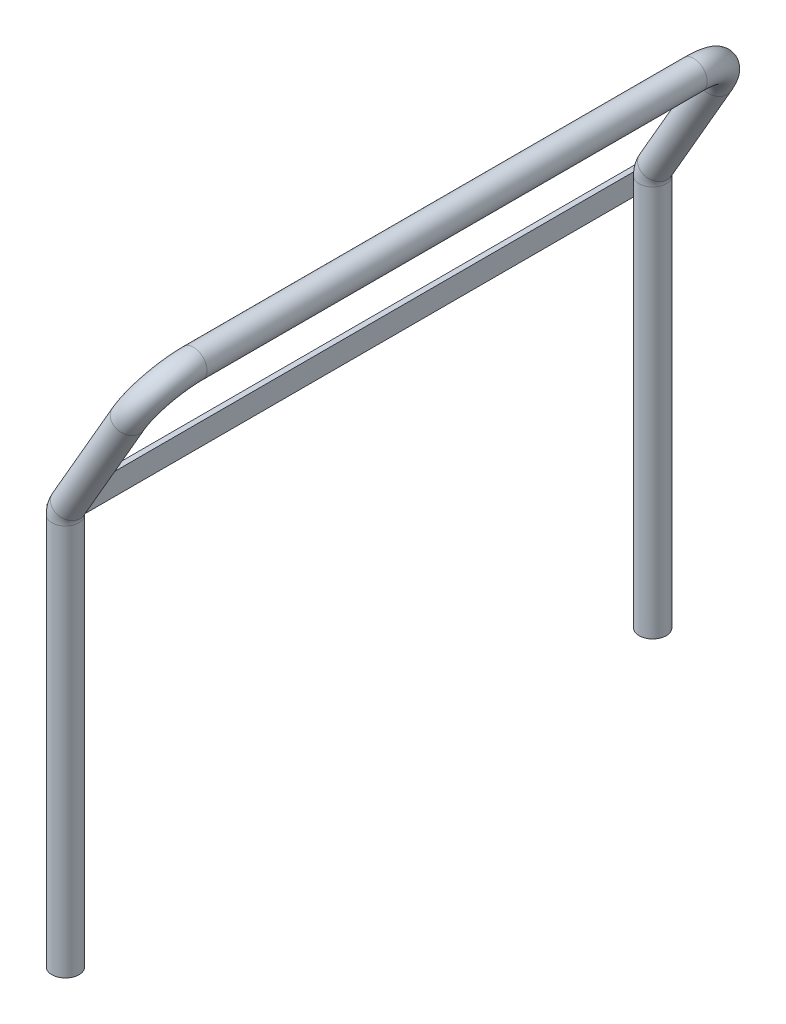
ISO-10303-21;
HEADER;
FILE_DESCRIPTION(('STEP AP214'),'2;1');
FILE_NAME('part.step','',(''),(''),'','','');
FILE_SCHEMA(('AUTOMOTIVE_DESIGN { 1 0 10303 214 1 1 1 1 }'));
ENDSEC;
DATA;
#1=APPLICATION_CONTEXT('core data for automotive mechanical design processes');
#2=APPLICATION_PROTOCOL_DEFINITION('international standard','automotive_design',2000,#1);
#3=PRODUCT_CONTEXT('',#1,'mechanical');
#4=PRODUCT('Part','Part','',(#3));
#5=PRODUCT_RELATED_PRODUCT_CATEGORY('part','',(#4));
#6=PRODUCT_DEFINITION_FORMATION('','',#4);
#7=PRODUCT_DEFINITION_CONTEXT('part definition',#1,'design');
#8=PRODUCT_DEFINITION('design','',#6,#7);
#9=PRODUCT_DEFINITION_SHAPE('','',#8);
#10=(LENGTH_UNIT() NAMED_UNIT(*) SI_UNIT(.MILLI.,.METRE.));
#11=(NAMED_UNIT(*) PLANE_ANGLE_UNIT() SI_UNIT($,.RADIAN.));
#12=(NAMED_UNIT(*) SI_UNIT($,.STERADIAN.) SOLID_ANGLE_UNIT());
#13=UNCERTAINTY_MEASURE_WITH_UNIT(LENGTH_MEASURE(1.E-05),#10,'distance_accuracy_value','');
#14=(GEOMETRIC_REPRESENTATION_CONTEXT(3) GLOBAL_UNCERTAINTY_ASSIGNED_CONTEXT((#13)) GLOBAL_UNIT_ASSIGNED_CONTEXT((#10,
#11,#12)) REPRESENTATION_CONTEXT('',''));
#15=CARTESIAN_POINT('',(0.,0.,0.));
#16=DIRECTION('',(0.,0.,1.));
#17=DIRECTION('',(1.,0.,0.));
#18=AXIS2_PLACEMENT_3D('',#15,#16,#17);
#19=CARTESIAN_POINT('',(0.,0.,0.));
#20=DIRECTION('',(0.,1.,0.));
#21=DIRECTION('',(0.,0.,1.));
#22=AXIS2_PLACEMENT_3D('',#19,#20,#21);
#23=PLANE('',#22);
#24=CARTESIAN_POINT('',(0.,0.,0.));
#25=DIRECTION('',(0.,1.,0.));
#26=DIRECTION('',(0.,0.,1.));
#27=AXIS2_PLACEMENT_3D('',#24,#25,#26);
#28=CIRCLE('',#27,15.875);
#29=CARTESIAN_POINT('',(0.,0.,15.875));
#30=VERTEX_POINT('',#29);
#31=EDGE_CURVE('E172',#30,#30,#28,.T.);
#32=ORIENTED_EDGE('',*,*,#31,.F.);
#33=EDGE_LOOP('',(#32));
#34=FACE_BOUND('',#33,.T.);
#35=ADVANCED_FACE('F41',(#34),#23,.F.);
#36=CARTESIAN_POINT('',(0.,0.,0.));
#37=DIRECTION('',(0.,1.,0.));
#38=DIRECTION('',(0.,0.,1.));
#39=AXIS2_PLACEMENT_3D('',#36,#37,#38);
#40=CYLINDRICAL_SURFACE('',#39,15.875);
#41=DIRECTION('',(0.,1.,0.));
#42=VECTOR('',#41,1.);
#43=CARTESIAN_POINT('',(-15.875,0.,0.));
#44=LINE('',#43,#42);
#45=CARTESIAN_POINT('',(-15.875,431.8,0.));
#46=VERTEX_POINT('',#45);
#47=CARTESIAN_POINT('',(-15.875,457.2,0.));
#48=VERTEX_POINT('',#47);
#49=EDGE_CURVE('E146',#46,#48,#44,.T.);
#50=ORIENTED_EDGE('',*,*,#49,.F.);
#51=CARTESIAN_POINT('',(0.,431.8,0.));
#52=DIRECTION('',(0.,-1.,0.));
#53=DIRECTION('',(0.,0.,-1.));
#54=AXIS2_PLACEMENT_3D('',#51,#52,#53);
#55=CIRCLE('',#54,15.875);
#56=CARTESIAN_POINT('',(-15.24,431.8,-4.44500000000003));
#57=VERTEX_POINT('',#56);
#58=EDGE_CURVE('E143',#57,#46,#55,.F.);
#59=ORIENTED_EDGE('',*,*,#58,.F.);
#60=DIRECTION('',(0.,1.,0.));
#61=VECTOR('',#60,1.);
#62=CARTESIAN_POINT('',(-15.24,0.,-4.44500000000001));
#63=LINE('',#62,#61);
#64=CARTESIAN_POINT('',(-15.24,457.2,-4.44500000000003));
#65=VERTEX_POINT('',#64);
#66=EDGE_CURVE('E133',#57,#65,#63,.T.);
#67=ORIENTED_EDGE('',*,*,#66,.T.);
#68=CARTESIAN_POINT('',(0.,457.2,0.));
#69=DIRECTION('',(0.,1.,0.));
#70=DIRECTION('',(0.,0.,1.));
#71=AXIS2_PLACEMENT_3D('',#68,#69,#70);
#72=CIRCLE('',#71,15.875);
#73=EDGE_CURVE('E176',#48,#65,#72,.T.);
#74=ORIENTED_EDGE('',*,*,#73,.F.);
#75=EDGE_LOOP('',(#50,#59,#67,#74));
#76=FACE_BOUND('',#75,.T.);
#77=ORIENTED_EDGE('',*,*,#31,.T.);
#78=EDGE_LOOP('',(#77));
#79=FACE_BOUND('',#78,.T.);
#80=ADVANCED_FACE('F211',(#76,#79),#40,.T.);
#81=CARTESIAN_POINT('',(25.4,457.2,0.));
#82=DIRECTION('',(0.,0.,-1.));
#83=DIRECTION('',(-1.,0.,0.));
#84=AXIS2_PLACEMENT_3D('',#81,#82,#83);
#85=TOROIDAL_SURFACE('',#84,25.4,15.875);
#86=CARTESIAN_POINT('',(3.40295474387527,469.9,0.));
#87=DIRECTION('',(0.500000000000001,0.866025403784438,0.));
#88=DIRECTION('',(0.,0.,1.));
#89=AXIS2_PLACEMENT_3D('',#86,#87,#88);
#90=CIRCLE('',#89,15.875);
#91=CARTESIAN_POINT('',(3.40295474387527,469.9,15.875));
#92=VERTEX_POINT('',#91);
#93=EDGE_CURVE('E181',#92,#92,#90,.T.);
#94=ORIENTED_EDGE('',*,*,#93,.F.);
#95=EDGE_LOOP('',(#94));
#96=FACE_BOUND('',#95,.T.);
#97=EDGE_CURVE('E177',#65,#48,#72,.T.);
#98=ORIENTED_EDGE('',*,*,#97,.T.);
#99=ORIENTED_EDGE('',*,*,#73,.T.);
#100=EDGE_LOOP('',(#98,#99));
#101=FACE_BOUND('',#100,.T.);
#102=ADVANCED_FACE('F205',(#96,#101),#85,.T.);
#103=CARTESIAN_POINT('',(3.40295474387526,469.9,0.));
#104=DIRECTION('',(0.500000000000001,0.866025403784438,0.));
#105=DIRECTION('',(-0.866025403784438,0.500000000000001,0.));
#106=AXIS2_PLACEMENT_3D('',#103,#104,#105);
#107=CYLINDRICAL_SURFACE('',#106,15.875);
#108=CARTESIAN_POINT('',(73.2529547438754,590.883748908686,0.));
#109=DIRECTION('',(0.500000000000001,0.866025403784438,0.));
#110=DIRECTION('',(0.,0.,1.));
#111=AXIS2_PLACEMENT_3D('',#108,#109,#110);
#112=CIRCLE('',#111,15.875);
#113=CARTESIAN_POINT('',(73.2529547438753,590.883748908686,15.8749999999999));
#114=VERTEX_POINT('',#113);
#115=EDGE_CURVE('E185',#114,#114,#112,.T.);
#116=ORIENTED_EDGE('',*,*,#115,.F.);
#117=EDGE_LOOP('',(#116));
#118=FACE_BOUND('',#117,.T.);
#119=ORIENTED_EDGE('',*,*,#93,.T.);
#120=EDGE_LOOP('',(#119));
#121=FACE_BOUND('',#120,.T.);
#122=ADVANCED_FACE('F223',(#118,#121),#107,.T.);
#123=CARTESIAN_POINT('',(73.2529547438755,590.883748908686,-635.));
#124=DIRECTION('',(0.866025403784438,-0.500000000000001,0.));
#125=DIRECTION('',(0.500000000000001,0.866025403784438,0.));
#126=AXIS2_PLACEMENT_3D('',#123,#124,#125);
#127=TOROIDAL_SURFACE('',#126,50.8000000000001,15.875);
#128=CARTESIAN_POINT('',(73.2529547438753,590.883748908686,-685.8));
#129=DIRECTION('',(-0.500000000000001,-0.866025403784438,0.));
#130=DIRECTION('',(-0.866025403784438,0.500000000000001,0.));
#131=AXIS2_PLACEMENT_3D('',#128,#129,#130);
#132=CIRCLE('',#131,15.875);
#133=CARTESIAN_POINT('',(73.2529547438753,590.883748908686,-701.675));
#134=VERTEX_POINT('',#133);
#135=EDGE_CURVE('E160',#134,#134,#132,.T.);
#136=CARTESIAN_POINT('',(98.6529547438756,634.877839420935,-635.));
#137=DIRECTION('',(0.,0.,-1.));
#138=DIRECTION('',(-0.866025403784438,0.500000000000001,0.));
#139=AXIS2_PLACEMENT_3D('',#136,#137,#138);
#140=CIRCLE('',#139,15.875);
#141=CARTESIAN_POINT('',(106.590454743876,648.625992706013,-635.));
#142=VERTEX_POINT('',#141);
#143=EDGE_CURVE('E164',#142,#142,#140,.T.);
#144=CARTESIAN_POINT('',(73.2529547438755,590.883748908686,-635.));
#145=DIRECTION('',(0.866025403784438,-0.500000000000001,0.));
#146=DIRECTION('',(0.500000000000001,0.866025403784438,0.));
#147=AXIS2_PLACEMENT_3D('',#144,#145,#146);
#148=CIRCLE('',#147,66.675);
#149=EDGE_CURVE('',#134,#142,#148,.T.);
#150=ORIENTED_EDGE('',*,*,#135,.F.);
#151=ORIENTED_EDGE('',*,*,#143,.T.);
#152=ORIENTED_EDGE('',*,*,#149,.T.);
#153=ORIENTED_EDGE('',*,*,#149,.F.);
#154=EDGE_LOOP('',(#150,#152,#151,#153));
#155=FACE_BOUND('',#154,.T.);
#156=ADVANCED_FACE('F225',(#155),#127,.T.);
#157=CARTESIAN_POINT('',(98.6529547438756,634.877839420936,-635.));
#158=DIRECTION('',(0.,0.,1.));
#159=DIRECTION('',(1.,0.,0.));
#160=AXIS2_PLACEMENT_3D('',#157,#158,#159);
#161=CYLINDRICAL_SURFACE('',#160,15.875);
#162=CARTESIAN_POINT('',(98.6529547438756,634.877839420936,-50.8000000000002));
#163=DIRECTION('',(0.,0.,-1.));
#164=DIRECTION('',(-0.866025403784438,0.500000000000001,0.));
#165=AXIS2_PLACEMENT_3D('',#162,#163,#164);
#166=CIRCLE('',#165,15.875);
#167=CARTESIAN_POINT('',(106.590454743876,648.625992706014,-50.8000000000003));
#168=VERTEX_POINT('',#167);
#169=EDGE_CURVE('E168',#168,#168,#166,.T.);
#170=ORIENTED_EDGE('',*,*,#169,.T.);
#171=EDGE_LOOP('',(#170));
#172=FACE_BOUND('',#171,.T.);
#173=ORIENTED_EDGE('',*,*,#143,.F.);
#174=EDGE_LOOP('',(#173));
#175=FACE_BOUND('',#174,.T.);
#176=ADVANCED_FACE('F231',(#172,#175),#161,.T.);
#177=CARTESIAN_POINT('',(73.2529547438756,590.883748908686,-50.8));
#178=DIRECTION('',(0.866025403784438,-0.500000000000001,0.));
#179=DIRECTION('',(0.500000000000001,0.866025403784438,0.));
#180=AXIS2_PLACEMENT_3D('',#177,#178,#179);
#181=TOROIDAL_SURFACE('',#180,50.8,15.875);
#182=CARTESIAN_POINT('',(73.2529547438756,590.883748908686,-50.8));
#183=DIRECTION('',(0.866025403784438,-0.500000000000001,0.));
#184=DIRECTION('',(0.500000000000001,0.866025403784438,0.));
#185=AXIS2_PLACEMENT_3D('',#182,#183,#184);
#186=CIRCLE('',#185,66.6749999999999);
#187=EDGE_CURVE('',#168,#114,#186,.T.);
#188=ORIENTED_EDGE('',*,*,#169,.F.);
#189=ORIENTED_EDGE('',*,*,#115,.T.);
#190=ORIENTED_EDGE('',*,*,#187,.T.);
#191=ORIENTED_EDGE('',*,*,#187,.F.);
#192=EDGE_LOOP('',(#188,#190,#189,#191));
#193=FACE_BOUND('',#192,.T.);
#194=ADVANCED_FACE('F241',(#193),#181,.T.);
#195=CARTESIAN_POINT('',(0.,2.22044604925031E-13,-685.8));
#196=DIRECTION('',(0.,-1.,0.));
#197=DIRECTION('',(1.,0.,0.));
#198=AXIS2_PLACEMENT_3D('',#195,#196,#197);
#199=PLANE('',#198);
#200=CARTESIAN_POINT('',(0.,2.22044604925031E-13,-685.8));
#201=DIRECTION('',(0.,-1.,0.));
#202=DIRECTION('',(1.,0.,0.));
#203=AXIS2_PLACEMENT_3D('',#200,#201,#202);
#204=CIRCLE('',#203,15.875);
#205=CARTESIAN_POINT('',(15.875,3.30437066597966E-13,-685.8));
#206=VERTEX_POINT('',#205);
#207=EDGE_CURVE('E156',#206,#206,#204,.T.);
#208=ORIENTED_EDGE('',*,*,#207,.T.);
#209=EDGE_LOOP('',(#208));
#210=FACE_BOUND('',#209,.T.);
#211=ADVANCED_FACE('F244',(#210),#199,.T.);
#212=CARTESIAN_POINT('',(73.2529547438755,590.883748908686,-685.8));
#213=DIRECTION('',(-0.500000000000005,-0.866025403784435,0.));
#214=DIRECTION('',(0.866025403784435,-0.500000000000005,0.));
#215=AXIS2_PLACEMENT_3D('',#212,#213,#214);
#216=CYLINDRICAL_SURFACE('',#215,15.875);
#217=CARTESIAN_POINT('',(3.40295474387474,469.9,-685.8));
#218=DIRECTION('',(-0.500000000000001,-0.866025403784438,0.));
#219=DIRECTION('',(0.866025403784438,-0.500000000000001,0.));
#220=AXIS2_PLACEMENT_3D('',#217,#218,#219);
#221=CIRCLE('',#220,15.875);
#222=CARTESIAN_POINT('',(17.1511080289527,461.9625,-685.8));
#223=VERTEX_POINT('',#222);
#224=EDGE_CURVE('E149',#223,#223,#221,.T.);
#225=ORIENTED_EDGE('',*,*,#224,.F.);
#226=EDGE_LOOP('',(#225));
#227=FACE_BOUND('',#226,.T.);
#228=ORIENTED_EDGE('',*,*,#135,.T.);
#229=EDGE_LOOP('',(#228));
#230=FACE_BOUND('',#229,.T.);
#231=ADVANCED_FACE('F251',(#227,#230),#216,.T.);
#232=CARTESIAN_POINT('',(25.3999999999993,457.2,-685.8));
#233=DIRECTION('',(0.,0.,1.));
#234=DIRECTION('',(1.,0.,0.));
#235=AXIS2_PLACEMENT_3D('',#232,#233,#234);
#236=TOROIDAL_SURFACE('',#235,25.4000000000004,15.875);
#237=CARTESIAN_POINT('',(-7.21644966006352E-13,457.2,-685.8));
#238=DIRECTION('',(0.,-1.,0.));
#239=DIRECTION('',(1.,0.,0.));
#240=AXIS2_PLACEMENT_3D('',#237,#238,#239);
#241=CIRCLE('',#240,15.875);
#242=CARTESIAN_POINT('',(-15.24,457.2,-681.354999999998));
#243=VERTEX_POINT('',#242);
#244=CARTESIAN_POINT('',(-15.8750000000007,457.2,-685.8));
#245=VERTEX_POINT('',#244);
#246=EDGE_CURVE('E97',#243,#245,#241,.T.);
#247=ORIENTED_EDGE('',*,*,#246,.F.);
#248=EDGE_CURVE('E153',#245,#243,#241,.T.);
#249=ORIENTED_EDGE('',*,*,#248,.F.);
#250=EDGE_LOOP('',(#247,#249));
#251=FACE_BOUND('',#250,.T.);
#252=ORIENTED_EDGE('',*,*,#224,.T.);
#253=EDGE_LOOP('',(#252));
#254=FACE_BOUND('',#253,.T.);
#255=ADVANCED_FACE('F255',(#251,#254),#236,.T.);
#256=CARTESIAN_POINT('',(-7.21644966006352E-13,457.2,-685.8));
#257=DIRECTION('',(0.,-1.,0.));
#258=DIRECTION('',(1.,0.,0.));
#259=AXIS2_PLACEMENT_3D('',#256,#257,#258);
#260=CYLINDRICAL_SURFACE('',#259,15.875);
#261=DIRECTION('',(0.,-1.,0.));
#262=VECTOR('',#261,1.);
#263=CARTESIAN_POINT('',(-15.8750000000007,457.2,-685.8));
#264=LINE('',#263,#262);
#265=CARTESIAN_POINT('',(-15.8750000000007,431.8,-685.8));
#266=VERTEX_POINT('',#265);
#267=EDGE_CURVE('E11',#245,#266,#264,.T.);
#268=ORIENTED_EDGE('',*,*,#267,.F.);
#269=ORIENTED_EDGE('',*,*,#248,.T.);
#270=DIRECTION('',(0.,-1.,0.));
#271=VECTOR('',#270,1.);
#272=CARTESIAN_POINT('',(-15.24,457.2,-681.354999999998));
#273=LINE('',#272,#271);
#274=CARTESIAN_POINT('',(-15.24,431.8,-681.354999999998));
#275=VERTEX_POINT('',#274);
#276=EDGE_CURVE('E189',#243,#275,#273,.T.);
#277=ORIENTED_EDGE('',*,*,#276,.T.);
#278=CARTESIAN_POINT('',(-6.80866917630092E-13,431.8,-685.8));
#279=DIRECTION('',(0.,-1.,0.));
#280=DIRECTION('',(0.,0.,-1.));
#281=AXIS2_PLACEMENT_3D('',#278,#279,#280);
#282=CIRCLE('',#281,15.875);
#283=EDGE_CURVE('E49',#266,#275,#282,.F.);
#284=ORIENTED_EDGE('',*,*,#283,.F.);
#285=EDGE_LOOP('',(#268,#269,#277,#284));
#286=FACE_BOUND('',#285,.T.);
#287=ORIENTED_EDGE('',*,*,#207,.F.);
#288=EDGE_LOOP('',(#287));
#289=FACE_BOUND('',#288,.T.);
#290=ADVANCED_FACE('F199',(#286,#289),#260,.T.);
#291=CARTESIAN_POINT('',(-21.59,457.2,-685.8));
#292=DIRECTION('',(0.,0.,-1.));
#293=DIRECTION('',(-1.,0.,0.));
#294=AXIS2_PLACEMENT_3D('',#291,#292,#293);
#295=PLANE('',#294);
#296=DIRECTION('',(1.,0.,0.));
#297=VECTOR('',#296,1.);
#298=CARTESIAN_POINT('',(-21.59,457.2,-685.8));
#299=LINE('',#298,#297);
#300=CARTESIAN_POINT('',(-21.59,457.2,-685.8));
#301=VERTEX_POINT('',#300);
#302=EDGE_CURVE('E91',#301,#245,#299,.T.);
#303=ORIENTED_EDGE('',*,*,#302,.T.);
#304=ORIENTED_EDGE('',*,*,#267,.T.);
#305=DIRECTION('',(1.,0.,0.));
#306=VECTOR('',#305,1.);
#307=CARTESIAN_POINT('',(-21.59,431.8,-685.8));
#308=LINE('',#307,#306);
#309=CARTESIAN_POINT('',(-21.59,431.8,-685.8));
#310=VERTEX_POINT('',#309);
#311=EDGE_CURVE('E117',#310,#266,#308,.T.);
#312=ORIENTED_EDGE('',*,*,#311,.F.);
#313=DIRECTION('',(0.,1.,0.));
#314=VECTOR('',#313,1.);
#315=CARTESIAN_POINT('',(-21.59,457.2,-685.8));
#316=LINE('',#315,#314);
#317=EDGE_CURVE('E109',#310,#301,#316,.T.);
#318=ORIENTED_EDGE('',*,*,#317,.T.);
#319=EDGE_LOOP('',(#303,#304,#312,#318));
#320=FACE_BOUND('',#319,.T.);
#321=ADVANCED_FACE('F115',(#320),#295,.T.);
#322=CARTESIAN_POINT('',(-21.59,431.8,-685.8));
#323=DIRECTION('',(0.,-1.,0.));
#324=DIRECTION('',(0.,0.,-1.));
#325=AXIS2_PLACEMENT_3D('',#322,#323,#324);
#326=PLANE('',#325);
#327=DIRECTION('',(0.,0.,-1.));
#328=VECTOR('',#327,1.);
#329=CARTESIAN_POINT('',(-15.24,431.8,-685.8));
#330=LINE('',#329,#328);
#331=EDGE_CURVE('E64',#57,#275,#330,.T.);
#332=ORIENTED_EDGE('',*,*,#331,.F.);
#333=ORIENTED_EDGE('',*,*,#58,.T.);
#334=DIRECTION('',(1.,0.,0.));
#335=VECTOR('',#334,1.);
#336=CARTESIAN_POINT('',(-21.59,431.8,0.));
#337=LINE('',#336,#335);
#338=CARTESIAN_POINT('',(-21.59,431.8,0.));
#339=VERTEX_POINT('',#338);
#340=EDGE_CURVE('E134',#339,#46,#337,.T.);
#341=ORIENTED_EDGE('',*,*,#340,.F.);
#342=DIRECTION('',(0.,0.,-1.));
#343=VECTOR('',#342,1.);
#344=CARTESIAN_POINT('',(-21.59,431.8,-685.8));
#345=LINE('',#344,#343);
#346=EDGE_CURVE('E102',#339,#310,#345,.T.);
#347=ORIENTED_EDGE('',*,*,#346,.T.);
#348=ORIENTED_EDGE('',*,*,#311,.T.);
#349=ORIENTED_EDGE('',*,*,#283,.T.);
#350=EDGE_LOOP('',(#332,#333,#341,#347,#348,#349));
#351=FACE_BOUND('',#350,.T.);
#352=ADVANCED_FACE('F195',(#351),#326,.T.);
#353=CARTESIAN_POINT('',(-21.59,457.2,0.));
#354=DIRECTION('',(0.,0.,1.));
#355=DIRECTION('',(0.,-1.,0.));
#356=AXIS2_PLACEMENT_3D('',#353,#354,#355);
#357=PLANE('',#356);
#358=ORIENTED_EDGE('',*,*,#340,.T.);
#359=ORIENTED_EDGE('',*,*,#49,.T.);
#360=DIRECTION('',(1.,0.,0.));
#361=VECTOR('',#360,1.);
#362=CARTESIAN_POINT('',(-21.59,457.2,0.));
#363=LINE('',#362,#361);
#364=CARTESIAN_POINT('',(-21.59,457.2,0.));
#365=VERTEX_POINT('',#364);
#366=EDGE_CURVE('E56',#365,#48,#363,.T.);
#367=ORIENTED_EDGE('',*,*,#366,.F.);
#368=DIRECTION('',(0.,-1.,0.));
#369=VECTOR('',#368,1.);
#370=CARTESIAN_POINT('',(-21.59,457.2,0.));
#371=LINE('',#370,#369);
#372=EDGE_CURVE('E112',#365,#339,#371,.T.);
#373=ORIENTED_EDGE('',*,*,#372,.T.);
#374=EDGE_LOOP('',(#358,#359,#367,#373));
#375=FACE_BOUND('',#374,.T.);
#376=ADVANCED_FACE('F214',(#375),#357,.T.);
#377=CARTESIAN_POINT('',(-21.59,457.2,-685.8));
#378=DIRECTION('',(0.,1.,0.));
#379=DIRECTION('',(0.,0.,1.));
#380=AXIS2_PLACEMENT_3D('',#377,#378,#379);
#381=PLANE('',#380);
#382=ORIENTED_EDGE('',*,*,#366,.T.);
#383=ORIENTED_EDGE('',*,*,#97,.F.);
#384=DIRECTION('',(0.,0.,1.));
#385=VECTOR('',#384,1.);
#386=CARTESIAN_POINT('',(-15.24,457.2,-685.8));
#387=LINE('',#386,#385);
#388=EDGE_CURVE('E121',#243,#65,#387,.T.);
#389=ORIENTED_EDGE('',*,*,#388,.F.);
#390=ORIENTED_EDGE('',*,*,#246,.T.);
#391=ORIENTED_EDGE('',*,*,#302,.F.);
#392=DIRECTION('',(0.,0.,1.));
#393=VECTOR('',#392,1.);
#394=CARTESIAN_POINT('',(-21.59,457.2,-685.8));
#395=LINE('',#394,#393);
#396=EDGE_CURVE('E94',#301,#365,#395,.T.);
#397=ORIENTED_EDGE('',*,*,#396,.T.);
#398=EDGE_LOOP('',(#382,#383,#389,#390,#391,#397));
#399=FACE_BOUND('',#398,.T.);
#400=ADVANCED_FACE('F93',(#399),#381,.T.);
#401=CARTESIAN_POINT('',(-21.59,0.,0.));
#402=DIRECTION('',(-1.,0.,0.));
#403=DIRECTION('',(0.,0.,1.));
#404=AXIS2_PLACEMENT_3D('',#401,#402,#403);
#405=PLANE('',#404);
#406=ORIENTED_EDGE('',*,*,#317,.F.);
#407=ORIENTED_EDGE('',*,*,#346,.F.);
#408=ORIENTED_EDGE('',*,*,#372,.F.);
#409=ORIENTED_EDGE('',*,*,#396,.F.);
#410=EDGE_LOOP('',(#406,#407,#408,#409));
#411=FACE_BOUND('',#410,.T.);
#412=ADVANCED_FACE('F107',(#411),#405,.T.);
#413=CARTESIAN_POINT('',(-15.24,0.,0.));
#414=DIRECTION('',(-1.,0.,0.));
#415=DIRECTION('',(0.,0.,1.));
#416=AXIS2_PLACEMENT_3D('',#413,#414,#415);
#417=PLANE('',#416);
#418=ORIENTED_EDGE('',*,*,#66,.F.);
#419=ORIENTED_EDGE('',*,*,#331,.T.);
#420=ORIENTED_EDGE('',*,*,#276,.F.);
#421=ORIENTED_EDGE('',*,*,#388,.T.);
#422=EDGE_LOOP('',(#418,#419,#420,#421));
#423=FACE_BOUND('',#422,.T.);
#424=ADVANCED_FACE('F202',(#423),#417,.F.);
#425=CLOSED_SHELL('',(#35,#80,#102,#122,#156,#176,#194,#211,#231,#255,#290,#321,#352,#376,#400,
#412,#424));
#426=MANIFOLD_SOLID_BREP('B2',#425);
#427=ADVANCED_BREP_SHAPE_REPRESENTATION('',(#18,#426),#14);
#428=SHAPE_DEFINITION_REPRESENTATION(#9,#427);
ENDSEC;
END-ISO-10303-21;
